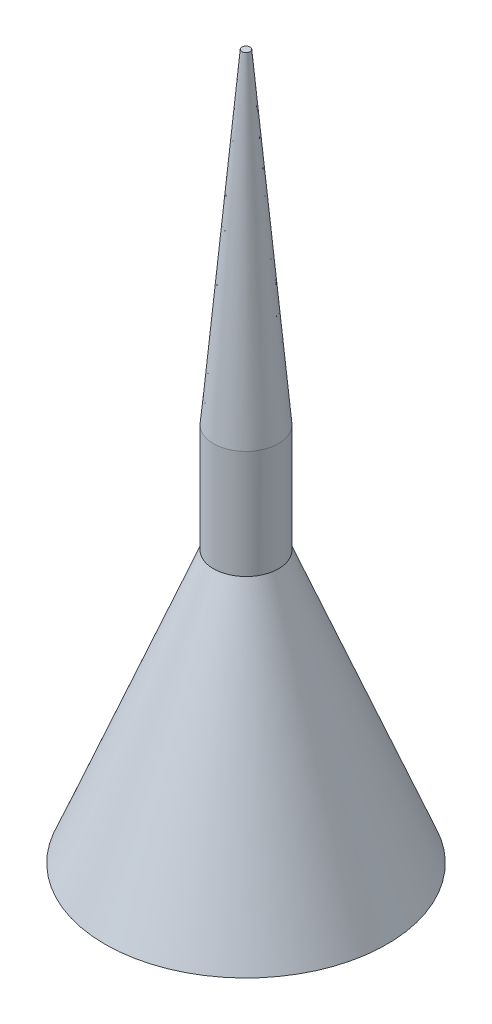
ISO-10303-21;
HEADER;
FILE_DESCRIPTION(('STEP AP214'),'2;1');
FILE_NAME('part.step','',(''),(''),'','','');
FILE_SCHEMA(('AUTOMOTIVE_DESIGN { 1 0 10303 214 1 1 1 1 }'));
ENDSEC;
DATA;
#1=APPLICATION_CONTEXT('core data for automotive mechanical design processes');
#2=APPLICATION_PROTOCOL_DEFINITION('international standard','automotive_design',2000,#1);
#3=PRODUCT_CONTEXT('',#1,'mechanical');
#4=PRODUCT('Part','Part','',(#3));
#5=PRODUCT_RELATED_PRODUCT_CATEGORY('part','',(#4));
#6=PRODUCT_DEFINITION_FORMATION('','',#4);
#7=PRODUCT_DEFINITION_CONTEXT('part definition',#1,'design');
#8=PRODUCT_DEFINITION('design','',#6,#7);
#9=PRODUCT_DEFINITION_SHAPE('','',#8);
#10=(LENGTH_UNIT() NAMED_UNIT(*) SI_UNIT(.MILLI.,.METRE.));
#11=(NAMED_UNIT(*) PLANE_ANGLE_UNIT() SI_UNIT($,.RADIAN.));
#12=(NAMED_UNIT(*) SI_UNIT($,.STERADIAN.) SOLID_ANGLE_UNIT());
#13=UNCERTAINTY_MEASURE_WITH_UNIT(LENGTH_MEASURE(1.E-05),#10,'distance_accuracy_value','');
#14=(GEOMETRIC_REPRESENTATION_CONTEXT(3) GLOBAL_UNCERTAINTY_ASSIGNED_CONTEXT((#13)) GLOBAL_UNIT_ASSIGNED_CONTEXT((#10,
#11,#12)) REPRESENTATION_CONTEXT('',''));
#15=CARTESIAN_POINT('',(0.,0.,0.));
#16=DIRECTION('',(0.,0.,1.));
#17=DIRECTION('',(1.,0.,0.));
#18=AXIS2_PLACEMENT_3D('',#15,#16,#17);
#19=CARTESIAN_POINT('',(0.,20.,0.));
#20=DIRECTION('',(0.,-1.,0.));
#21=DIRECTION('',(0.,0.,-1.));
#22=AXIS2_PLACEMENT_3D('',#19,#20,#21);
#23=CYLINDRICAL_SURFACE('',#22,6.);
#24=CARTESIAN_POINT('',(0.,20.,0.));
#25=DIRECTION('',(0.,1.,0.));
#26=DIRECTION('',(0.,0.,1.));
#27=AXIS2_PLACEMENT_3D('',#24,#25,#26);
#28=CIRCLE('',#27,6.);
#29=CARTESIAN_POINT('',(0.,20.,6.));
#30=VERTEX_POINT('',#29);
#31=EDGE_CURVE('E11',#30,#30,#28,.T.);
#32=ORIENTED_EDGE('',*,*,#31,.F.);
#33=EDGE_LOOP('',(#32));
#34=FACE_BOUND('',#33,.T.);
#35=CARTESIAN_POINT('',(0.,0.,0.));
#36=DIRECTION('',(0.,1.,0.));
#37=DIRECTION('',(0.,0.,1.));
#38=AXIS2_PLACEMENT_3D('',#35,#36,#37);
#39=CIRCLE('',#38,6.);
#40=CARTESIAN_POINT('',(0.,0.,-6.00000000000001));
#41=VERTEX_POINT('',#40);
#42=EDGE_CURVE('E50',#41,#41,#39,.T.);
#43=ORIENTED_EDGE('',*,*,#42,.T.);
#44=EDGE_LOOP('',(#43));
#45=FACE_BOUND('',#44,.T.);
#46=ADVANCED_FACE('F45',(#34,#45),#23,.T.);
#47=CARTESIAN_POINT('',(0.,-50.,0.));
#48=DIRECTION('',(0.,-1.,0.));
#49=DIRECTION('',(0.,0.,-1.));
#50=AXIS2_PLACEMENT_3D('',#47,#48,#49);
#51=PLANE('',#50);
#52=CARTESIAN_POINT('',(0.,-50.,0.));
#53=DIRECTION('',(0.,-1.,0.));
#54=DIRECTION('',(0.,0.,-1.));
#55=AXIS2_PLACEMENT_3D('',#52,#53,#54);
#56=CIRCLE('',#55,15.2296703857309);
#57=CARTESIAN_POINT('',(0.,-50.,-15.2296703857309));
#58=VERTEX_POINT('',#57);
#59=EDGE_CURVE('E63',#58,#58,#56,.T.);
#60=ORIENTED_EDGE('',*,*,#59,.F.);
#61=EDGE_LOOP('',(#60));
#62=FACE_BOUND('',#61,.T.);
#63=CARTESIAN_POINT('',(0.,-50.,0.));
#64=DIRECTION('',(0.,-1.,0.));
#65=DIRECTION('',(0.,0.,-1.));
#66=AXIS2_PLACEMENT_3D('',#63,#64,#65);
#67=CIRCLE('',#66,26.);
#68=CARTESIAN_POINT('',(0.,-50.,-25.9999999999999));
#69=VERTEX_POINT('',#68);
#70=EDGE_CURVE('E65',#69,#69,#67,.T.);
#71=ORIENTED_EDGE('',*,*,#70,.T.);
#72=EDGE_LOOP('',(#71));
#73=FACE_BOUND('',#72,.T.);
#74=ADVANCED_FACE('F83',(#62,#73),#51,.T.);
#75=CARTESIAN_POINT('',(0.,-50.0000000000004,0.));
#76=DIRECTION('',(0.,-1.,0.));
#77=DIRECTION('',(0.,0.,-1.));
#78=AXIS2_PLACEMENT_3D('',#75,#76,#77);
#79=CONICAL_SURFACE('',#78,26.,0.380506377112362);
#80=CARTESIAN_POINT('',(0.,0.,-6.00000000000001));
#81=CARTESIAN_POINT('',(0.,-0.520833333333334,-6.20833333333334));
#82=CARTESIAN_POINT('',(0.,-1.04166666666667,-6.41666666666667));
#83=CARTESIAN_POINT('',(0.,-2.08333333333334,-6.83333333333334));
#84=CARTESIAN_POINT('',(0.,-2.60416666666667,-7.04166666666667));
#85=CARTESIAN_POINT('',(0.,-3.64583333333333,-7.45833333333333));
#86=CARTESIAN_POINT('',(0.,-4.16666666666667,-7.66666666666667));
#87=CARTESIAN_POINT('',(0.,-5.20833333333333,-8.08333333333333));
#88=CARTESIAN_POINT('',(0.,-5.72916666666667,-8.29166666666666));
#89=CARTESIAN_POINT('',(0.,-6.77083333333333,-8.70833333333332));
#90=CARTESIAN_POINT('',(0.,-7.29166666666667,-8.91666666666666));
#91=CARTESIAN_POINT('',(0.,-8.33333333333333,-9.33333333333332));
#92=CARTESIAN_POINT('',(0.,-8.85416666666667,-9.54166666666665));
#93=CARTESIAN_POINT('',(0.,-9.89583333333334,-9.95833333333331));
#94=CARTESIAN_POINT('',(0.,-10.4166666666667,-10.1666666666666));
#95=CARTESIAN_POINT('',(0.,-11.4583333333333,-10.5833333333333));
#96=CARTESIAN_POINT('',(0.,-11.9791666666667,-10.7916666666666));
#97=CARTESIAN_POINT('',(0.,-13.0208333333333,-11.2083333333333));
#98=CARTESIAN_POINT('',(0.,-13.5416666666667,-11.4166666666666));
#99=CARTESIAN_POINT('',(0.,-14.5833333333333,-11.8333333333333));
#100=CARTESIAN_POINT('',(0.,-15.1041666666667,-12.0416666666666));
#101=CARTESIAN_POINT('',(0.,-16.1458333333333,-12.4583333333333));
#102=CARTESIAN_POINT('',(0.,-16.6666666666667,-12.6666666666666));
#103=CARTESIAN_POINT('',(0.,-17.7083333333333,-13.0833333333333));
#104=CARTESIAN_POINT('',(0.,-18.2291666666667,-13.2916666666666));
#105=CARTESIAN_POINT('',(0.,-19.2708333333333,-13.7083333333333));
#106=CARTESIAN_POINT('',(0.,-19.7916666666667,-13.9166666666666));
#107=CARTESIAN_POINT('',(0.,-20.8333333333333,-14.3333333333333));
#108=CARTESIAN_POINT('',(0.,-21.3541666666667,-14.5416666666666));
#109=CARTESIAN_POINT('',(0.,-22.3958333333333,-14.9583333333333));
#110=CARTESIAN_POINT('',(0.,-22.9166666666667,-15.1666666666666));
#111=CARTESIAN_POINT('',(0.,-23.9583333333333,-15.5833333333333));
#112=CARTESIAN_POINT('',(0.,-24.4791666666667,-15.7916666666666));
#113=CARTESIAN_POINT('',(0.,-25.5208333333333,-16.2083333333333));
#114=CARTESIAN_POINT('',(0.,-26.0416666666667,-16.4166666666666));
#115=CARTESIAN_POINT('',(0.,-27.0833333333333,-16.8333333333333));
#116=CARTESIAN_POINT('',(0.,-27.6041666666667,-17.0416666666666));
#117=CARTESIAN_POINT('',(0.,-28.6458333333333,-17.4583333333333));
#118=CARTESIAN_POINT('',(0.,-29.1666666666667,-17.6666666666666));
#119=CARTESIAN_POINT('',(0.,-30.2083333333333,-18.0833333333332));
#120=CARTESIAN_POINT('',(0.,-30.7291666666667,-18.2916666666666));
#121=CARTESIAN_POINT('',(0.,-31.7708333333333,-18.7083333333332));
#122=CARTESIAN_POINT('',(0.,-32.2916666666667,-18.9166666666666));
#123=CARTESIAN_POINT('',(0.,-33.3333333333333,-19.3333333333332));
#124=CARTESIAN_POINT('',(0.,-33.8541666666667,-19.5416666666666));
#125=CARTESIAN_POINT('',(0.,-34.8958333333333,-19.9583333333332));
#126=CARTESIAN_POINT('',(0.,-35.4166666666667,-20.1666666666666));
#127=CARTESIAN_POINT('',(0.,-36.4583333333333,-20.5833333333332));
#128=CARTESIAN_POINT('',(0.,-36.9791666666667,-20.7916666666666));
#129=CARTESIAN_POINT('',(0.,-38.0208333333333,-21.2083333333332));
#130=CARTESIAN_POINT('',(0.,-38.5416666666667,-21.4166666666666));
#131=CARTESIAN_POINT('',(0.,-39.5833333333333,-21.8333333333332));
#132=CARTESIAN_POINT('',(0.,-40.1041666666667,-22.0416666666666));
#133=CARTESIAN_POINT('',(0.,-41.1458333333333,-22.4583333333332));
#134=CARTESIAN_POINT('',(0.,-41.6666666666667,-22.6666666666665));
#135=CARTESIAN_POINT('',(0.,-42.7083333333333,-23.0833333333332));
#136=CARTESIAN_POINT('',(0.,-43.2291666666667,-23.2916666666665));
#137=CARTESIAN_POINT('',(0.,-44.2708333333333,-23.7083333333332));
#138=CARTESIAN_POINT('',(0.,-44.7916666666667,-23.9166666666665));
#139=CARTESIAN_POINT('',(0.,-45.8333333333333,-24.3333333333332));
#140=CARTESIAN_POINT('',(0.,-46.3541666666667,-24.5416666666665));
#141=CARTESIAN_POINT('',(0.,-47.3958333333333,-24.9583333333332));
#142=CARTESIAN_POINT('',(0.,-47.9166666666667,-25.1666666666665));
#143=CARTESIAN_POINT('',(0.,-48.9583333333333,-25.5833333333332));
#144=CARTESIAN_POINT('',(0.,-49.4791666666667,-25.7916666666665));
#145=CARTESIAN_POINT('',(0.,-50.,-25.9999999999999));
#146=B_SPLINE_CURVE_WITH_KNOTS('',3,(#80,#81,#82,#83,#84,#85,#86,#87,#88,#89,#90,#91,#92,#93,
#94,#95,#96,#97,#98,#99,#100,#101,#102,#103,#104,#105,#106,#107,#108,#109,#110,#111,#112,#113,
#114,#115,#116,#117,#118,#119,#120,#121,#122,#123,#124,#125,#126,#127,#128,#129,#130,#131,#132,
#133,#134,#135,#136,#137,#138,#139,#140,#141,#142,#143,#144,#145),.UNSPECIFIED.,.F.,.F.,(4,2,2,
2,2,2,2,2,2,2,2,2,2,2,2,2,2,2,2,2,2,2,2,2,2,2,2,2,2,2,2,2,4),(0.,1.68286400222953,
3.36572800445906,5.04859200668859,6.73145600891812,8.41432001114765,10.0971840133772,
11.7800480156067,13.4629120178362,15.1457760200658,16.8286400222953,18.5115040245248,
20.1943680267544,21.8772320289839,23.5600960312134,25.242960033443,26.9258240356725,
28.608688037902,30.2915520401315,31.9744160423611,33.6572800445906,35.3401440468201,
37.0230080490497,38.7058720512792,40.3887360535087,42.0716000557383,43.7544640579678,
45.4373280601973,47.1201920624268,48.8030560646564,50.4859200668859,52.1687840691154,
53.851648071345),.UNSPECIFIED.);
#147=EDGE_CURVE('BSEAM48',#41,#69,#146,.T.);
#148=ORIENTED_EDGE('',*,*,#42,.F.);
#149=ORIENTED_EDGE('',*,*,#70,.F.);
#150=ORIENTED_EDGE('',*,*,#147,.T.);
#151=ORIENTED_EDGE('',*,*,#147,.F.);
#152=EDGE_LOOP('',(#148,#150,#149,#151));
#153=FACE_BOUND('',#152,.T.);
#154=ADVANCED_FACE('F48',(#153),#79,.T.);
#155=CARTESIAN_POINT('',(0.,-53.7139067635414,0.));
#156=DIRECTION('',(0.,-1.,0.));
#157=DIRECTION('',(0.,0.,-1.));
#158=AXIS2_PLACEMENT_3D('',#155,#156,#157);
#159=CONICAL_SURFACE('',#158,16.7152330911474,0.380506377112362);
#160=CARTESIAN_POINT('',(0.,-11.9258240356726,0.));
#161=VERTEX_POINT('',#160);
#162=VERTEX_LOOP('',#161);
#163=FACE_BOUND('',#162,.T.);
#164=ORIENTED_EDGE('',*,*,#59,.T.);
#165=EDGE_LOOP('',(#164));
#166=FACE_BOUND('',#165,.T.);
#167=ADVANCED_FACE('F56',(#163,#166),#159,.F.);
#168=CARTESIAN_POINT('',(0.,20.,0.));
#169=DIRECTION('',(0.,-1.,0.));
#170=DIRECTION('',(0.,0.,1.));
#171=AXIS2_PLACEMENT_3D('',#168,#169,#170);
#172=CONICAL_SURFACE('',#171,6.,0.0872664625997165);
#173=CARTESIAN_POINT('',(0.,80.,0.));
#174=DIRECTION('',(0.,1.,0.));
#175=DIRECTION('',(0.,0.,1.));
#176=AXIS2_PLACEMENT_3D('',#173,#174,#175);
#177=CIRCLE('',#176,0.750680188444558);
#178=CARTESIAN_POINT('',(0.,80.,0.750680188444558));
#179=VERTEX_POINT('',#178);
#180=EDGE_CURVE('E66',#179,#179,#177,.T.);
#181=CARTESIAN_POINT('',(0.,80.,0.750680188444558));
#182=CARTESIAN_POINT('',(0.,79.375,0.805360603148261));
#183=CARTESIAN_POINT('',(0.,78.75,0.860041017851964));
#184=CARTESIAN_POINT('',(0.,77.5,0.969401847259369));
#185=CARTESIAN_POINT('',(0.,76.875,1.02408226196307));
#186=CARTESIAN_POINT('',(0.,75.625,1.13344309137048));
#187=CARTESIAN_POINT('',(0.,75.,1.18812350607418));
#188=CARTESIAN_POINT('',(0.,73.75,1.29748433548158));
#189=CARTESIAN_POINT('',(0.,73.125,1.35216475018529));
#190=CARTESIAN_POINT('',(0.,71.875,1.46152557959269));
#191=CARTESIAN_POINT('',(0.,71.25,1.51620599429639));
#192=CARTESIAN_POINT('',(0.,70.,1.6255668237038));
#193=CARTESIAN_POINT('',(0.,69.375,1.6802472384075));
#194=CARTESIAN_POINT('',(0.,68.125,1.78960806781491));
#195=CARTESIAN_POINT('',(0.,67.5,1.84428848251861));
#196=CARTESIAN_POINT('',(0.,66.25,1.95364931192601));
#197=CARTESIAN_POINT('',(0.,65.625,2.00832972662972));
#198=CARTESIAN_POINT('',(0.,64.375,2.11769055603712));
#199=CARTESIAN_POINT('',(0.,63.75,2.17237097074082));
#200=CARTESIAN_POINT('',(0.,62.5,2.28173180014823));
#201=CARTESIAN_POINT('',(0.,61.875,2.33641221485193));
#202=CARTESIAN_POINT('',(0.,60.625,2.44577304425934));
#203=CARTESIAN_POINT('',(0.,60.,2.50045345896304));
#204=CARTESIAN_POINT('',(0.,58.75,2.60981428837044));
#205=CARTESIAN_POINT('',(0.,58.125,2.66449470307415));
#206=CARTESIAN_POINT('',(0.,56.875,2.77385553248155));
#207=CARTESIAN_POINT('',(0.,56.25,2.82853594718525));
#208=CARTESIAN_POINT('',(0.,55.,2.93789677659266));
#209=CARTESIAN_POINT('',(0.,54.375,2.99257719129636));
#210=CARTESIAN_POINT('',(0.,53.125,3.10193802070377));
#211=CARTESIAN_POINT('',(0.,52.5,3.15661843540747));
#212=CARTESIAN_POINT('',(0.,51.25,3.26597926481487));
#213=CARTESIAN_POINT('',(0.,50.625,3.32065967951858));
#214=CARTESIAN_POINT('',(0.,49.375,3.43002050892598));
#215=CARTESIAN_POINT('',(0.,48.75,3.48470092362968));
#216=CARTESIAN_POINT('',(0.,47.5,3.59406175303709));
#217=CARTESIAN_POINT('',(0.,46.875,3.64874216774079));
#218=CARTESIAN_POINT('',(0.,45.625,3.7581029971482));
#219=CARTESIAN_POINT('',(0.,45.,3.8127834118519));
#220=CARTESIAN_POINT('',(0.,43.75,3.9221442412593));
#221=CARTESIAN_POINT('',(0.,43.125,3.97682465596301));
#222=CARTESIAN_POINT('',(0.,41.875,4.08618548537041));
#223=CARTESIAN_POINT('',(0.,41.25,4.14086590007411));
#224=CARTESIAN_POINT('',(0.,40.,4.25022672948152));
#225=CARTESIAN_POINT('',(0.,39.375,4.30490714418522));
#226=CARTESIAN_POINT('',(0.,38.125,4.41426797359262));
#227=CARTESIAN_POINT('',(0.,37.5,4.46894838829633));
#228=CARTESIAN_POINT('',(0.,36.25,4.57830921770373));
#229=CARTESIAN_POINT('',(0.,35.625,4.63298963240744));
#230=CARTESIAN_POINT('',(0.,34.375,4.74235046181484));
#231=CARTESIAN_POINT('',(0.,33.75,4.79703087651854));
#232=CARTESIAN_POINT('',(0.,32.5,4.90639170592595));
#233=CARTESIAN_POINT('',(0.,31.875,4.96107212062965));
#234=CARTESIAN_POINT('',(0.,30.625,5.07043295003706));
#235=CARTESIAN_POINT('',(0.,30.,5.12511336474076));
#236=CARTESIAN_POINT('',(0.,28.75,5.23447419414816));
#237=CARTESIAN_POINT('',(0.,28.125,5.28915460885187));
#238=CARTESIAN_POINT('',(0.,26.875,5.39851543825927));
#239=CARTESIAN_POINT('',(0.,26.25,5.45319585296297));
#240=CARTESIAN_POINT('',(0.,25.,5.56255668237038));
#241=CARTESIAN_POINT('',(0.,24.375,5.61723709707408));
#242=CARTESIAN_POINT('',(0.,23.125,5.72659792648149));
#243=CARTESIAN_POINT('',(0.,22.5,5.78127834118519));
#244=CARTESIAN_POINT('',(0.,21.25,5.89063917059259));
#245=CARTESIAN_POINT('',(0.,20.625,5.9453195852963));
#246=CARTESIAN_POINT('',(0.,20.,6.));
#247=B_SPLINE_CURVE_WITH_KNOTS('',3,(#181,#182,#183,#184,#185,#186,#187,#188,#189,#190,#191,
#192,#193,#194,#195,#196,#197,#198,#199,#200,#201,#202,#203,#204,#205,#206,#207,#208,#209,#210,
#211,#212,#213,#214,#215,#216,#217,#218,#219,#220,#221,#222,#223,#224,#225,#226,#227,#228,#229,
#230,#231,#232,#233,#234,#235,#236,#237,#238,#239,#240,#241,#242,#243,#244,#245,#246),
.UNSPECIFIED.,.F.,.F.,(4,2,2,2,2,2,2,2,2,2,2,2,2,2,2,2,2,2,2,2,2,2,2,2,2,2,2,2,2,2,2,2,4),(0.,
1.88216219539378,3.76432439078756,5.64648658618133,7.52864878157511,9.41081097696889,
11.2929731723627,13.1751353677564,15.0572975631502,16.939459758544,18.8216219539378,
20.7037841493315,22.5859463447253,24.4681085401191,26.3502707355129,28.2324329309066,
30.1145951263004,31.9967573216942,33.878919517088,35.7610817124817,37.6432439078755,
39.5254061032693,41.4075682986631,43.2897304940568,45.1718926894506,47.0540548848444,
48.9362170802382,50.818379275632,52.7005414710257,54.5827036664195,56.4648658618133,
58.3470280572071,60.2291902526008),.UNSPECIFIED.);
#248=EDGE_CURVE('BSEAM59',#179,#30,#247,.T.);
#249=ORIENTED_EDGE('',*,*,#180,.F.);
#250=ORIENTED_EDGE('',*,*,#31,.T.);
#251=ORIENTED_EDGE('',*,*,#248,.T.);
#252=ORIENTED_EDGE('',*,*,#248,.F.);
#253=EDGE_LOOP('',(#249,#251,#250,#252));
#254=FACE_BOUND('',#253,.T.);
#255=ADVANCED_FACE('F59',(#254),#172,.T.);
#256=CARTESIAN_POINT('',(0.,80.,0.));
#257=DIRECTION('',(0.,1.,0.));
#258=DIRECTION('',(0.,0.,1.));
#259=AXIS2_PLACEMENT_3D('',#256,#257,#258);
#260=PLANE('',#259);
#261=ORIENTED_EDGE('',*,*,#180,.T.);
#262=EDGE_LOOP('',(#261));
#263=FACE_BOUND('',#262,.T.);
#264=ADVANCED_FACE('F74',(#263),#260,.T.);
#265=CLOSED_SHELL('',(#46,#74,#154,#167,#255,#264));
#266=MANIFOLD_SOLID_BREP('B2',#265);
#267=ADVANCED_BREP_SHAPE_REPRESENTATION('',(#18,#266),#14);
#268=SHAPE_DEFINITION_REPRESENTATION(#9,#267);
ENDSEC;
END-ISO-10303-21;
